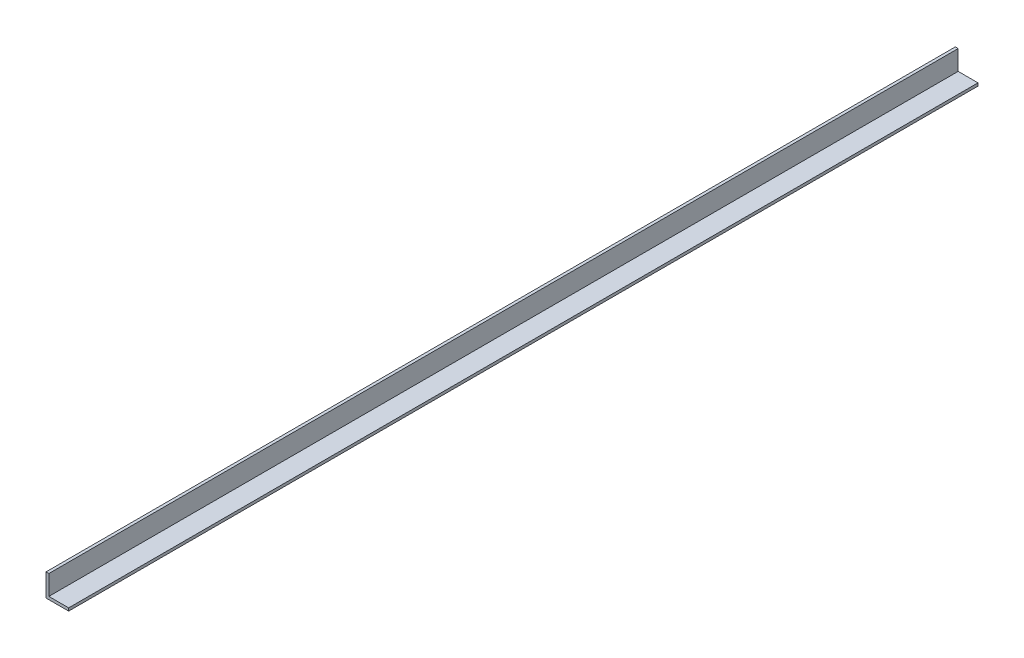
ISO-10303-21;
HEADER;
FILE_DESCRIPTION(('STEP AP214'),'2;1');
FILE_NAME('part.step','',(''),(''),'','','');
FILE_SCHEMA(('AUTOMOTIVE_DESIGN { 1 0 10303 214 1 1 1 1 }'));
ENDSEC;
DATA;
#1=APPLICATION_CONTEXT('core data for automotive mechanical design processes');
#2=APPLICATION_PROTOCOL_DEFINITION('international standard','automotive_design',2000,#1);
#3=PRODUCT_CONTEXT('',#1,'mechanical');
#4=PRODUCT('Part','Part','',(#3));
#5=PRODUCT_RELATED_PRODUCT_CATEGORY('part','',(#4));
#6=PRODUCT_DEFINITION_FORMATION('','',#4);
#7=PRODUCT_DEFINITION_CONTEXT('part definition',#1,'design');
#8=PRODUCT_DEFINITION('design','',#6,#7);
#9=PRODUCT_DEFINITION_SHAPE('','',#8);
#10=(LENGTH_UNIT() NAMED_UNIT(*) SI_UNIT(.MILLI.,.METRE.));
#11=(NAMED_UNIT(*) PLANE_ANGLE_UNIT() SI_UNIT($,.RADIAN.));
#12=(NAMED_UNIT(*) SI_UNIT($,.STERADIAN.) SOLID_ANGLE_UNIT());
#13=UNCERTAINTY_MEASURE_WITH_UNIT(LENGTH_MEASURE(1.E-05),#10,'distance_accuracy_value','');
#14=(GEOMETRIC_REPRESENTATION_CONTEXT(3) GLOBAL_UNCERTAINTY_ASSIGNED_CONTEXT((#13)) GLOBAL_UNIT_ASSIGNED_CONTEXT((#10,
#11,#12)) REPRESENTATION_CONTEXT('',''));
#15=CARTESIAN_POINT('',(0.,0.,0.));
#16=DIRECTION('',(0.,0.,1.));
#17=DIRECTION('',(1.,0.,0.));
#18=AXIS2_PLACEMENT_3D('',#15,#16,#17);
#19=CARTESIAN_POINT('',(19.05,152.,-6100.));
#20=DIRECTION('',(0.,1.,0.));
#21=DIRECTION('',(0.,0.,1.));
#22=AXIS2_PLACEMENT_3D('',#19,#20,#21);
#23=PLANE('',#22);
#24=DIRECTION('',(-1.,0.,0.));
#25=VECTOR('',#24,1.);
#26=CARTESIAN_POINT('',(19.05,152.,0.));
#27=LINE('',#26,#25);
#28=CARTESIAN_POINT('',(19.05,152.,0.));
#29=VERTEX_POINT('',#28);
#30=CARTESIAN_POINT('',(0.,152.,0.));
#31=VERTEX_POINT('',#30);
#32=EDGE_CURVE('E118',#29,#31,#27,.T.);
#33=ORIENTED_EDGE('',*,*,#32,.F.);
#34=DIRECTION('',(0.,0.,1.));
#35=VECTOR('',#34,1.);
#36=CARTESIAN_POINT('',(19.05,152.,-6100.));
#37=LINE('',#36,#35);
#38=CARTESIAN_POINT('',(19.05,152.,-6100.));
#39=VERTEX_POINT('',#38);
#40=EDGE_CURVE('E11',#39,#29,#37,.T.);
#41=ORIENTED_EDGE('',*,*,#40,.F.);
#42=DIRECTION('',(-1.,0.,0.));
#43=VECTOR('',#42,1.);
#44=CARTESIAN_POINT('',(19.05,152.,-6100.));
#45=LINE('',#44,#43);
#46=CARTESIAN_POINT('',(0.,152.,-6100.));
#47=VERTEX_POINT('',#46);
#48=EDGE_CURVE('E132',#39,#47,#45,.T.);
#49=ORIENTED_EDGE('',*,*,#48,.T.);
#50=DIRECTION('',(0.,0.,1.));
#51=VECTOR('',#50,1.);
#52=CARTESIAN_POINT('',(0.,152.,-6100.));
#53=LINE('',#52,#51);
#54=EDGE_CURVE('E36',#47,#31,#53,.T.);
#55=ORIENTED_EDGE('',*,*,#54,.T.);
#56=EDGE_LOOP('',(#33,#41,#49,#55));
#57=FACE_BOUND('',#56,.T.);
#58=ADVANCED_FACE('F33',(#57),#23,.T.);
#59=CARTESIAN_POINT('',(19.05,19.05,-6100.));
#60=DIRECTION('',(1.,0.,0.));
#61=DIRECTION('',(0.,1.,0.));
#62=AXIS2_PLACEMENT_3D('',#59,#60,#61);
#63=PLANE('',#62);
#64=DIRECTION('',(0.,1.,0.));
#65=VECTOR('',#64,1.);
#66=CARTESIAN_POINT('',(19.05,19.05,0.));
#67=LINE('',#66,#65);
#68=CARTESIAN_POINT('',(19.05,19.05,0.));
#69=VERTEX_POINT('',#68);
#70=EDGE_CURVE('E130',#69,#29,#67,.T.);
#71=ORIENTED_EDGE('',*,*,#70,.F.);
#72=DIRECTION('',(0.,0.,1.));
#73=VECTOR('',#72,1.);
#74=CARTESIAN_POINT('',(19.05,19.05,-6100.));
#75=LINE('',#74,#73);
#76=CARTESIAN_POINT('',(19.05,19.05,-6100.));
#77=VERTEX_POINT('',#76);
#78=EDGE_CURVE('E42',#77,#69,#75,.T.);
#79=ORIENTED_EDGE('',*,*,#78,.F.);
#80=DIRECTION('',(0.,1.,0.));
#81=VECTOR('',#80,1.);
#82=CARTESIAN_POINT('',(19.05,19.05,-6100.));
#83=LINE('',#82,#81);
#84=EDGE_CURVE('E108',#77,#39,#83,.T.);
#85=ORIENTED_EDGE('',*,*,#84,.T.);
#86=ORIENTED_EDGE('',*,*,#40,.T.);
#87=EDGE_LOOP('',(#71,#79,#85,#86));
#88=FACE_BOUND('',#87,.T.);
#89=ADVANCED_FACE('F140',(#88),#63,.T.);
#90=CARTESIAN_POINT('',(152.,19.05,-6100.));
#91=DIRECTION('',(0.,1.,0.));
#92=DIRECTION('',(-1.,0.,0.));
#93=AXIS2_PLACEMENT_3D('',#90,#91,#92);
#94=PLANE('',#93);
#95=DIRECTION('',(-1.,0.,0.));
#96=VECTOR('',#95,1.);
#97=CARTESIAN_POINT('',(152.,19.05,0.));
#98=LINE('',#97,#96);
#99=CARTESIAN_POINT('',(152.,19.05,0.));
#100=VERTEX_POINT('',#99);
#101=EDGE_CURVE('E95',#100,#69,#98,.T.);
#102=ORIENTED_EDGE('',*,*,#101,.F.);
#103=DIRECTION('',(0.,0.,1.));
#104=VECTOR('',#103,1.);
#105=CARTESIAN_POINT('',(152.,19.05,-6100.));
#106=LINE('',#105,#104);
#107=CARTESIAN_POINT('',(152.,19.05,-6100.));
#108=VERTEX_POINT('',#107);
#109=EDGE_CURVE('E90',#108,#100,#106,.T.);
#110=ORIENTED_EDGE('',*,*,#109,.F.);
#111=DIRECTION('',(-1.,0.,0.));
#112=VECTOR('',#111,1.);
#113=CARTESIAN_POINT('',(152.,19.05,-6100.));
#114=LINE('',#113,#112);
#115=EDGE_CURVE('E93',#108,#77,#114,.T.);
#116=ORIENTED_EDGE('',*,*,#115,.T.);
#117=ORIENTED_EDGE('',*,*,#78,.T.);
#118=EDGE_LOOP('',(#102,#110,#116,#117));
#119=FACE_BOUND('',#118,.T.);
#120=ADVANCED_FACE('F92',(#119),#94,.T.);
#121=CARTESIAN_POINT('',(152.,0.,-6100.));
#122=DIRECTION('',(1.,0.,0.));
#123=DIRECTION('',(0.,0.,-1.));
#124=AXIS2_PLACEMENT_3D('',#121,#122,#123);
#125=PLANE('',#124);
#126=DIRECTION('',(0.,1.,0.));
#127=VECTOR('',#126,1.);
#128=CARTESIAN_POINT('',(152.,0.,0.));
#129=LINE('',#128,#127);
#130=CARTESIAN_POINT('',(152.,0.,0.));
#131=VERTEX_POINT('',#130);
#132=EDGE_CURVE('E127',#131,#100,#129,.T.);
#133=ORIENTED_EDGE('',*,*,#132,.F.);
#134=DIRECTION('',(0.,0.,1.));
#135=VECTOR('',#134,1.);
#136=CARTESIAN_POINT('',(152.,0.,-6100.));
#137=LINE('',#136,#135);
#138=CARTESIAN_POINT('',(152.,0.,-6100.));
#139=VERTEX_POINT('',#138);
#140=EDGE_CURVE('E100',#139,#131,#137,.T.);
#141=ORIENTED_EDGE('',*,*,#140,.F.);
#142=DIRECTION('',(0.,1.,0.));
#143=VECTOR('',#142,1.);
#144=CARTESIAN_POINT('',(152.,0.,-6100.));
#145=LINE('',#144,#143);
#146=EDGE_CURVE('E106',#139,#108,#145,.T.);
#147=ORIENTED_EDGE('',*,*,#146,.T.);
#148=ORIENTED_EDGE('',*,*,#109,.T.);
#149=EDGE_LOOP('',(#133,#141,#147,#148));
#150=FACE_BOUND('',#149,.T.);
#151=ADVANCED_FACE('F110',(#150),#125,.T.);
#152=CARTESIAN_POINT('',(0.,0.,-6100.));
#153=DIRECTION('',(0.,-1.,0.));
#154=DIRECTION('',(0.,0.,-1.));
#155=AXIS2_PLACEMENT_3D('',#152,#153,#154);
#156=PLANE('',#155);
#157=DIRECTION('',(1.,0.,0.));
#158=VECTOR('',#157,1.);
#159=CARTESIAN_POINT('',(0.,0.,0.));
#160=LINE('',#159,#158);
#161=CARTESIAN_POINT('',(0.,0.,0.));
#162=VERTEX_POINT('',#161);
#163=EDGE_CURVE('E124',#162,#131,#160,.T.);
#164=ORIENTED_EDGE('',*,*,#163,.F.);
#165=DIRECTION('',(0.,0.,1.));
#166=VECTOR('',#165,1.);
#167=CARTESIAN_POINT('',(0.,0.,-6100.));
#168=LINE('',#167,#166);
#169=CARTESIAN_POINT('',(0.,0.,-6100.));
#170=VERTEX_POINT('',#169);
#171=EDGE_CURVE('E135',#170,#162,#168,.T.);
#172=ORIENTED_EDGE('',*,*,#171,.F.);
#173=DIRECTION('',(1.,0.,0.));
#174=VECTOR('',#173,1.);
#175=CARTESIAN_POINT('',(0.,0.,-6100.));
#176=LINE('',#175,#174);
#177=EDGE_CURVE('E111',#170,#139,#176,.T.);
#178=ORIENTED_EDGE('',*,*,#177,.T.);
#179=ORIENTED_EDGE('',*,*,#140,.T.);
#180=EDGE_LOOP('',(#164,#172,#178,#179));
#181=FACE_BOUND('',#180,.T.);
#182=ADVANCED_FACE('F153',(#181),#156,.T.);
#183=CARTESIAN_POINT('',(0.,152.,-6100.));
#184=DIRECTION('',(-1.,0.,0.));
#185=DIRECTION('',(0.,-1.,0.));
#186=AXIS2_PLACEMENT_3D('',#183,#184,#185);
#187=PLANE('',#186);
#188=DIRECTION('',(0.,-1.,0.));
#189=VECTOR('',#188,1.);
#190=CARTESIAN_POINT('',(0.,152.,0.));
#191=LINE('',#190,#189);
#192=EDGE_CURVE('E121',#31,#162,#191,.T.);
#193=ORIENTED_EDGE('',*,*,#192,.F.);
#194=ORIENTED_EDGE('',*,*,#54,.F.);
#195=DIRECTION('',(0.,-1.,0.));
#196=VECTOR('',#195,1.);
#197=CARTESIAN_POINT('',(0.,152.,-6100.));
#198=LINE('',#197,#196);
#199=EDGE_CURVE('E113',#47,#170,#198,.T.);
#200=ORIENTED_EDGE('',*,*,#199,.T.);
#201=ORIENTED_EDGE('',*,*,#171,.T.);
#202=EDGE_LOOP('',(#193,#194,#200,#201));
#203=FACE_BOUND('',#202,.T.);
#204=ADVANCED_FACE('F137',(#203),#187,.T.);
#205=CARTESIAN_POINT('',(0.,0.,-6100.));
#206=DIRECTION('',(0.,0.,1.));
#207=DIRECTION('',(1.,0.,0.));
#208=AXIS2_PLACEMENT_3D('',#205,#206,#207);
#209=PLANE('',#208);
#210=ORIENTED_EDGE('',*,*,#48,.F.);
#211=ORIENTED_EDGE('',*,*,#84,.F.);
#212=ORIENTED_EDGE('',*,*,#115,.F.);
#213=ORIENTED_EDGE('',*,*,#146,.F.);
#214=ORIENTED_EDGE('',*,*,#177,.F.);
#215=ORIENTED_EDGE('',*,*,#199,.F.);
#216=EDGE_LOOP('',(#210,#211,#212,#213,#214,#215));
#217=FACE_BOUND('',#216,.T.);
#218=ADVANCED_FACE('F104',(#217),#209,.F.);
#219=CARTESIAN_POINT('',(0.,0.,0.));
#220=DIRECTION('',(0.,0.,1.));
#221=DIRECTION('',(1.,0.,0.));
#222=AXIS2_PLACEMENT_3D('',#219,#220,#221);
#223=PLANE('',#222);
#224=ORIENTED_EDGE('',*,*,#32,.T.);
#225=ORIENTED_EDGE('',*,*,#192,.T.);
#226=ORIENTED_EDGE('',*,*,#163,.T.);
#227=ORIENTED_EDGE('',*,*,#132,.T.);
#228=ORIENTED_EDGE('',*,*,#101,.T.);
#229=ORIENTED_EDGE('',*,*,#70,.T.);
#230=EDGE_LOOP('',(#224,#225,#226,#227,#228,#229));
#231=FACE_BOUND('',#230,.T.);
#232=ADVANCED_FACE('F139',(#231),#223,.T.);
#233=CLOSED_SHELL('',(#58,#89,#120,#151,#182,#204,#218,#232));
#234=MANIFOLD_SOLID_BREP('B2',#233);
#235=ADVANCED_BREP_SHAPE_REPRESENTATION('',(#18,#234),#14);
#236=SHAPE_DEFINITION_REPRESENTATION(#9,#235);
ENDSEC;
END-ISO-10303-21;
